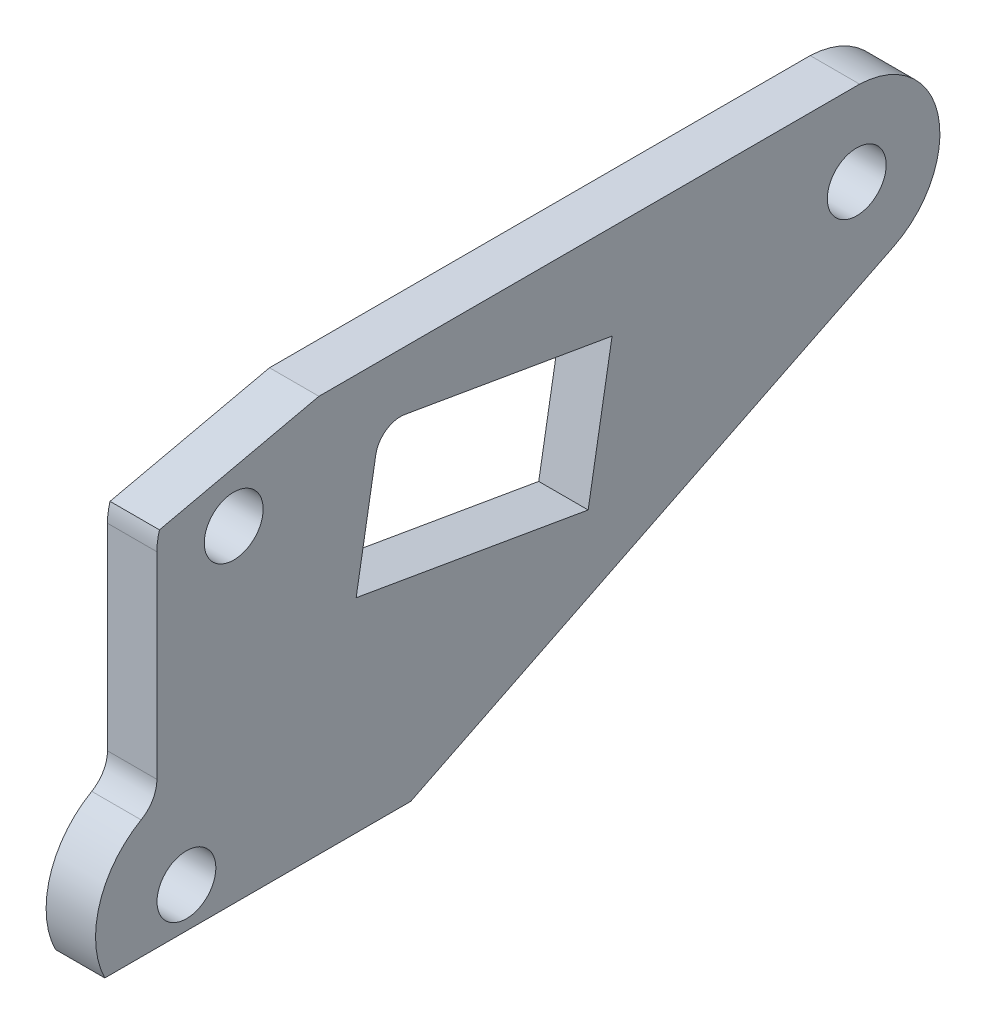
ISO-10303-21;
HEADER;
FILE_DESCRIPTION(('STEP AP214'),'2;1');
FILE_NAME('part.step','',(''),(''),'','','');
FILE_SCHEMA(('AUTOMOTIVE_DESIGN { 1 0 10303 214 1 1 1 1 }'));
ENDSEC;
DATA;
#1=APPLICATION_CONTEXT('core data for automotive mechanical design processes');
#2=APPLICATION_PROTOCOL_DEFINITION('international standard','automotive_design',2000,#1);
#3=PRODUCT_CONTEXT('',#1,'mechanical');
#4=PRODUCT('Part','Part','',(#3));
#5=PRODUCT_RELATED_PRODUCT_CATEGORY('part','',(#4));
#6=PRODUCT_DEFINITION_FORMATION('','',#4);
#7=PRODUCT_DEFINITION_CONTEXT('part definition',#1,'design');
#8=PRODUCT_DEFINITION('design','',#6,#7);
#9=PRODUCT_DEFINITION_SHAPE('','',#8);
#10=(LENGTH_UNIT() NAMED_UNIT(*) SI_UNIT(.MILLI.,.METRE.));
#11=(NAMED_UNIT(*) PLANE_ANGLE_UNIT() SI_UNIT($,.RADIAN.));
#12=(NAMED_UNIT(*) SI_UNIT($,.STERADIAN.) SOLID_ANGLE_UNIT());
#13=UNCERTAINTY_MEASURE_WITH_UNIT(LENGTH_MEASURE(1.E-05),#10,'distance_accuracy_value','');
#14=(GEOMETRIC_REPRESENTATION_CONTEXT(3) GLOBAL_UNCERTAINTY_ASSIGNED_CONTEXT((#13)) GLOBAL_UNIT_ASSIGNED_CONTEXT((#10,
#11,#12)) REPRESENTATION_CONTEXT('',''));
#15=CARTESIAN_POINT('',(0.,0.,0.));
#16=DIRECTION('',(0.,0.,1.));
#17=DIRECTION('',(1.,0.,0.));
#18=AXIS2_PLACEMENT_3D('',#15,#16,#17);
#19=CARTESIAN_POINT('',(2.,6.52334532425955,37.8465687056194));
#20=DIRECTION('',(0.,-0.169858235561271,-0.985468507772832));
#21=DIRECTION('',(0.,0.985468507772832,-0.169858235561271));
#22=AXIS2_PLACEMENT_3D('',#19,#20,#21);
#23=PLANE('',#22);
#24=DIRECTION('',(0.,-0.985468507772832,0.169858235561271));
#25=VECTOR('',#24,1.);
#26=CARTESIAN_POINT('',(-2.,6.52334532425955,37.8465687056194));
#27=LINE('',#26,#25);
#28=CARTESIAN_POINT('',(-2.,0.318688832561539,38.9160214538614));
#29=VERTEX_POINT('',#28);
#30=CARTESIAN_POINT('',(-2.,-8.89472787232873,40.504072916328));
#31=VERTEX_POINT('',#30);
#32=EDGE_CURVE('E205',#29,#31,#27,.T.);
#33=ORIENTED_EDGE('',*,*,#32,.F.);
#34=DIRECTION('',(-1.,0.,0.));
#35=VECTOR('',#34,1.);
#36=CARTESIAN_POINT('',(2.,0.318688832561539,38.9160214538614));
#37=LINE('',#36,#35);
#38=CARTESIAN_POINT('',(2.,0.318688832561539,38.9160214538614));
#39=VERTEX_POINT('',#38);
#40=EDGE_CURVE('E11',#39,#29,#37,.T.);
#41=ORIENTED_EDGE('',*,*,#40,.F.);
#42=DIRECTION('',(0.,-0.985468507772832,0.169858235561271));
#43=VECTOR('',#42,1.);
#44=CARTESIAN_POINT('',(2.,6.52334532425955,37.8465687056194));
#45=LINE('',#44,#43);
#46=CARTESIAN_POINT('',(2.,-8.89472787232873,40.504072916328));
#47=VERTEX_POINT('',#46);
#48=EDGE_CURVE('E242',#39,#47,#45,.T.);
#49=ORIENTED_EDGE('',*,*,#48,.T.);
#50=DIRECTION('',(-1.,0.,0.));
#51=VECTOR('',#50,1.);
#52=CARTESIAN_POINT('',(2.,-8.89472787232873,40.504072916328));
#53=LINE('',#52,#51);
#54=EDGE_CURVE('E56',#47,#31,#53,.T.);
#55=ORIENTED_EDGE('',*,*,#54,.T.);
#56=EDGE_LOOP('',(#33,#41,#49,#55));
#57=FACE_BOUND('',#56,.T.);
#58=ADVANCED_FACE('F37',(#57),#23,.T.);
#59=CARTESIAN_POINT('',(2.,-0.02646310209895,36.913549446067));
#60=DIRECTION('',(-1.,0.,0.));
#61=DIRECTION('',(0.,0.,1.));
#62=AXIS2_PLACEMENT_3D('',#59,#60,#61);
#63=CYLINDRICAL_SURFACE('',#62,2.032);
#64=CARTESIAN_POINT('',(-2.,-0.02646310209895,36.913549446067));
#65=DIRECTION('',(1.,0.,0.));
#66=DIRECTION('',(0.,0.,-1.));
#67=AXIS2_PLACEMENT_3D('',#64,#65,#66);
#68=CIRCLE('',#67,2.032);
#69=CARTESIAN_POINT('',(-2.,1.97600890569544,36.5683975114065));
#70=VERTEX_POINT('',#69);
#71=EDGE_CURVE('E202',#29,#70,#68,.F.);
#72=ORIENTED_EDGE('',*,*,#71,.T.);
#73=DIRECTION('',(-1.,0.,0.));
#74=VECTOR('',#73,1.);
#75=CARTESIAN_POINT('',(2.,1.97600890569544,36.5683975114065));
#76=LINE('',#75,#74);
#77=CARTESIAN_POINT('',(2.,1.97600890569544,36.5683975114065));
#78=VERTEX_POINT('',#77);
#79=EDGE_CURVE('E47',#78,#70,#76,.T.);
#80=ORIENTED_EDGE('',*,*,#79,.F.);
#81=CARTESIAN_POINT('',(2.,-0.02646310209895,36.913549446067));
#82=DIRECTION('',(1.,0.,0.));
#83=DIRECTION('',(0.,0.,-1.));
#84=AXIS2_PLACEMENT_3D('',#81,#82,#83);
#85=CIRCLE('',#84,2.032);
#86=EDGE_CURVE('E161',#39,#78,#85,.F.);
#87=ORIENTED_EDGE('',*,*,#86,.F.);
#88=ORIENTED_EDGE('',*,*,#40,.T.);
#89=EDGE_LOOP('',(#72,#80,#87,#88));
#90=FACE_BOUND('',#89,.T.);
#91=ADVANCED_FACE('F329',(#90),#63,.F.);
#92=CARTESIAN_POINT('',(2.,-4.2021844839036,0.724300813581509));
#93=DIRECTION('',(0.,0.985468507772832,-0.169858235561271));
#94=DIRECTION('',(0.,0.169858235561271,0.985468507772832));
#95=AXIS2_PLACEMENT_3D('',#92,#93,#94);
#96=PLANE('',#95);
#97=DIRECTION('',(0.,-0.169858235561271,-0.985468507772832));
#98=VECTOR('',#97,1.);
#99=CARTESIAN_POINT('',(-2.,-4.2021844839036,0.724300813581509));
#100=LINE('',#99,#98);
#101=CARTESIAN_POINT('',(-2.,-0.914638547086267,19.7976944461285));
#102=VERTEX_POINT('',#101);
#103=EDGE_CURVE('E167',#70,#102,#100,.T.);
#104=ORIENTED_EDGE('',*,*,#103,.T.);
#105=DIRECTION('',(-1.,0.,0.));
#106=VECTOR('',#105,1.);
#107=CARTESIAN_POINT('',(2.,-0.914638547086267,19.7976944461285));
#108=LINE('',#107,#106);
#109=CARTESIAN_POINT('',(2.,-0.914638547086267,19.7976944461285));
#110=VERTEX_POINT('',#109);
#111=EDGE_CURVE('E150',#110,#102,#108,.T.);
#112=ORIENTED_EDGE('',*,*,#111,.F.);
#113=DIRECTION('',(0.,-0.169858235561271,-0.985468507772832));
#114=VECTOR('',#113,1.);
#115=CARTESIAN_POINT('',(2.,-4.2021844839036,0.724300813581509));
#116=LINE('',#115,#114);
#117=EDGE_CURVE('E155',#78,#110,#116,.T.);
#118=ORIENTED_EDGE('',*,*,#117,.F.);
#119=ORIENTED_EDGE('',*,*,#79,.T.);
#120=EDGE_LOOP('',(#104,#112,#118,#119));
#121=FACE_BOUND('',#120,.T.);
#122=ADVANCED_FACE('F166',(#121),#96,.F.);
#123=CARTESIAN_POINT('',(2.,3.28754593681734,19.073393632547));
#124=DIRECTION('',(0.,-0.169858235561272,-0.985468507772832));
#125=DIRECTION('',(0.,0.985468507772832,-0.169858235561272));
#126=AXIS2_PLACEMENT_3D('',#123,#124,#125);
#127=PLANE('',#126);
#128=DIRECTION('',(0.,-0.985468507772832,0.169858235561272));
#129=VECTOR('',#128,1.);
#130=CARTESIAN_POINT('',(-2.,3.28754593681734,19.073393632547));
#131=LINE('',#130,#129);
#132=CARTESIAN_POINT('',(-2.,-12.1305272597709,21.7308978432556));
#133=VERTEX_POINT('',#132);
#134=EDGE_CURVE('E199',#102,#133,#131,.T.);
#135=ORIENTED_EDGE('',*,*,#134,.T.);
#136=DIRECTION('',(-1.,0.,0.));
#137=VECTOR('',#136,1.);
#138=CARTESIAN_POINT('',(2.,-12.1305272597709,21.7308978432556));
#139=LINE('',#138,#137);
#140=CARTESIAN_POINT('',(2.,-12.1305272597709,21.7308978432556));
#141=VERTEX_POINT('',#140);
#142=EDGE_CURVE('E100',#141,#133,#139,.T.);
#143=ORIENTED_EDGE('',*,*,#142,.F.);
#144=DIRECTION('',(0.,-0.985468507772832,0.169858235561272));
#145=VECTOR('',#144,1.);
#146=CARTESIAN_POINT('',(2.,3.28754593681734,19.073393632547));
#147=LINE('',#146,#145);
#148=EDGE_CURVE('E146',#110,#141,#147,.T.);
#149=ORIENTED_EDGE('',*,*,#148,.F.);
#150=ORIENTED_EDGE('',*,*,#111,.T.);
#151=EDGE_LOOP('',(#135,#143,#149,#150));
#152=FACE_BOUND('',#151,.T.);
#153=ADVANCED_FACE('F148',(#152),#127,.F.);
#154=CARTESIAN_POINT('',(2.,0.,56.6254002273468));
#155=DIRECTION('',(0.,0.,-1.));
#156=DIRECTION('',(-1.,0.,0.));
#157=AXIS2_PLACEMENT_3D('',#154,#155,#156);
#158=PLANE('',#157);
#159=DIRECTION('',(0.,-1.,0.));
#160=VECTOR('',#159,1.);
#161=CARTESIAN_POINT('',(-2.,0.,56.6254002273468));
#162=LINE('',#161,#160);
#163=CARTESIAN_POINT('',(-2.,2.38699131838962,56.6254002273468));
#164=VERTEX_POINT('',#163);
#165=CARTESIAN_POINT('',(-2.,-13.5592215366912,56.6254002273468));
#166=VERTEX_POINT('',#165);
#167=EDGE_CURVE('E229',#164,#166,#162,.T.);
#168=ORIENTED_EDGE('',*,*,#167,.T.);
#169=DIRECTION('',(-1.,0.,0.));
#170=VECTOR('',#169,1.);
#171=CARTESIAN_POINT('',(2.,-13.5592215366912,56.6254002273468));
#172=LINE('',#171,#170);
#173=CARTESIAN_POINT('',(2.,-13.5592215366912,56.6254002273468));
#174=VERTEX_POINT('',#173);
#175=EDGE_CURVE('E41',#174,#166,#172,.T.);
#176=ORIENTED_EDGE('',*,*,#175,.F.);
#177=DIRECTION('',(0.,-1.,0.));
#178=VECTOR('',#177,1.);
#179=CARTESIAN_POINT('',(2.,0.,56.6254002273468));
#180=LINE('',#179,#178);
#181=CARTESIAN_POINT('',(2.,2.38699131838962,56.6254002273468));
#182=VERTEX_POINT('',#181);
#183=EDGE_CURVE('E265',#182,#174,#180,.T.);
#184=ORIENTED_EDGE('',*,*,#183,.F.);
#185=DIRECTION('',(-1.,0.,0.));
#186=VECTOR('',#185,1.);
#187=CARTESIAN_POINT('',(2.,2.38699131838962,56.6254002273468));
#188=LINE('',#187,#186);
#189=EDGE_CURVE('E173',#182,#164,#188,.T.);
#190=ORIENTED_EDGE('',*,*,#189,.T.);
#191=EDGE_LOOP('',(#168,#176,#184,#190));
#192=FACE_BOUND('',#191,.T.);
#193=ADVANCED_FACE('F291',(#192),#158,.F.);
#194=CARTESIAN_POINT('',(2.,-13.5592215366912,59.1654002273468));
#195=DIRECTION('',(-1.,0.,0.));
#196=DIRECTION('',(0.,0.,1.));
#197=AXIS2_PLACEMENT_3D('',#194,#195,#196);
#198=CYLINDRICAL_SURFACE('',#197,2.54);
#199=CARTESIAN_POINT('',(-2.,-13.5592215366912,59.1654002273468));
#200=DIRECTION('',(1.,0.,0.));
#201=DIRECTION('',(0.,0.,-1.));
#202=AXIS2_PLACEMENT_3D('',#199,#200,#201);
#203=CIRCLE('',#202,2.54);
#204=CARTESIAN_POINT('',(-2.,-15.7615105365102,57.8998872241437));
#205=VERTEX_POINT('',#204);
#206=EDGE_CURVE('E227',#166,#205,#203,.F.);
#207=ORIENTED_EDGE('',*,*,#206,.T.);
#208=DIRECTION('',(-1.,0.,0.));
#209=VECTOR('',#208,1.);
#210=CARTESIAN_POINT('',(2.,-15.7615105365102,57.8998872241437));
#211=LINE('',#210,#209);
#212=CARTESIAN_POINT('',(2.,-15.7615105365102,57.8998872241437));
#213=VERTEX_POINT('',#212);
#214=EDGE_CURVE('E186',#213,#205,#211,.T.);
#215=ORIENTED_EDGE('',*,*,#214,.F.);
#216=CARTESIAN_POINT('',(2.,-13.5592215366912,59.1654002273468));
#217=DIRECTION('',(1.,0.,0.));
#218=DIRECTION('',(0.,0.,-1.));
#219=AXIS2_PLACEMENT_3D('',#216,#217,#218);
#220=CIRCLE('',#219,2.54);
#221=EDGE_CURVE('E113',#174,#213,#220,.F.);
#222=ORIENTED_EDGE('',*,*,#221,.F.);
#223=ORIENTED_EDGE('',*,*,#175,.T.);
#224=EDGE_LOOP('',(#207,#215,#222,#223));
#225=FACE_BOUND('',#224,.T.);
#226=ADVANCED_FACE('F320',(#225),#198,.F.);
#227=CARTESIAN_POINT('',(2.,-22.137211246104,54.2361845251858));
#228=DIRECTION('',(-1.,0.,0.));
#229=DIRECTION('',(0.,0.,1.));
#230=AXIS2_PLACEMENT_3D('',#227,#228,#229);
#231=CYLINDRICAL_SURFACE('',#230,7.35338541113316);
#232=CARTESIAN_POINT('',(-2.,-22.137211246104,54.2361845251858));
#233=DIRECTION('',(1.,0.,0.));
#234=DIRECTION('',(0.,0.,-1.));
#235=AXIS2_PLACEMENT_3D('',#232,#233,#234);
#236=CIRCLE('',#235,7.35338541113316);
#237=CARTESIAN_POINT('',(-2.,-25.3718603453728,60.8399199990873));
#238=VERTEX_POINT('',#237);
#239=EDGE_CURVE('E225',#205,#238,#236,.T.);
#240=ORIENTED_EDGE('',*,*,#239,.T.);
#241=DIRECTION('',(-1.,0.,0.));
#242=VECTOR('',#241,1.);
#243=CARTESIAN_POINT('',(2.,-25.3718603453728,60.8399199990873));
#244=LINE('',#243,#242);
#245=CARTESIAN_POINT('',(2.,-25.3718603453728,60.8399199990873));
#246=VERTEX_POINT('',#245);
#247=EDGE_CURVE('E185',#246,#238,#244,.T.);
#248=ORIENTED_EDGE('',*,*,#247,.F.);
#249=CARTESIAN_POINT('',(2.,-22.137211246104,54.2361845251858));
#250=DIRECTION('',(1.,0.,0.));
#251=DIRECTION('',(0.,0.,-1.));
#252=AXIS2_PLACEMENT_3D('',#249,#250,#251);
#253=CIRCLE('',#252,7.35338541113316);
#254=EDGE_CURVE('E262',#213,#246,#253,.T.);
#255=ORIENTED_EDGE('',*,*,#254,.F.);
#256=ORIENTED_EDGE('',*,*,#214,.T.);
#257=EDGE_LOOP('',(#240,#248,#255,#256));
#258=FACE_BOUND('',#257,.T.);
#259=ADVANCED_FACE('F318',(#258),#231,.T.);
#260=CARTESIAN_POINT('',(2.,-25.3718603453728,0.));
#261=DIRECTION('',(0.,-1.,0.));
#262=DIRECTION('',(0.,0.,-1.));
#263=AXIS2_PLACEMENT_3D('',#260,#261,#262);
#264=PLANE('',#263);
#265=DIRECTION('',(0.,0.,1.));
#266=VECTOR('',#265,1.);
#267=CARTESIAN_POINT('',(-2.,-25.3718603453728,0.));
#268=LINE('',#267,#266);
#269=CARTESIAN_POINT('',(-2.,-25.3718603453728,36.0875206472883));
#270=VERTEX_POINT('',#269);
#271=EDGE_CURVE('E222',#270,#238,#268,.T.);
#272=ORIENTED_EDGE('',*,*,#271,.F.);
#273=DIRECTION('',(-1.,0.,0.));
#274=VECTOR('',#273,1.);
#275=CARTESIAN_POINT('',(2.,-25.3718603453728,36.0875206472883));
#276=LINE('',#275,#274);
#277=CARTESIAN_POINT('',(2.,-25.3718603453728,36.0875206472883));
#278=VERTEX_POINT('',#277);
#279=EDGE_CURVE('E183',#278,#270,#276,.T.);
#280=ORIENTED_EDGE('',*,*,#279,.F.);
#281=DIRECTION('',(0.,0.,1.));
#282=VECTOR('',#281,1.);
#283=CARTESIAN_POINT('',(2.,-25.3718603453728,0.));
#284=LINE('',#283,#282);
#285=EDGE_CURVE('E259',#278,#246,#284,.T.);
#286=ORIENTED_EDGE('',*,*,#285,.T.);
#287=ORIENTED_EDGE('',*,*,#247,.T.);
#288=EDGE_LOOP('',(#272,#280,#286,#287));
#289=FACE_BOUND('',#288,.T.);
#290=ADVANCED_FACE('F315',(#289),#264,.T.);
#291=CARTESIAN_POINT('',(2.,-6.03157576772591,-2.98549735266419));
#292=DIRECTION('',(0.,-0.896220268256161,-0.443609322227177));
#293=DIRECTION('',(0.,0.443609322227177,-0.896220268256161));
#294=AXIS2_PLACEMENT_3D('',#291,#292,#293);
#295=PLANE('',#294);
#296=DIRECTION('',(0.,-0.443609322227177,0.896220268256161));
#297=VECTOR('',#296,1.);
#298=CARTESIAN_POINT('',(-2.,-6.03157576772591,-2.98549735266419));
#299=LINE('',#298,#297);
#300=CARTESIAN_POINT('',(-2.,-6.0315757677259,-2.98549735266419));
#301=VERTEX_POINT('',#300);
#302=EDGE_CURVE('E219',#301,#270,#299,.T.);
#303=ORIENTED_EDGE('',*,*,#302,.F.);
#304=DIRECTION('',(-1.,0.,0.));
#305=VECTOR('',#304,1.);
#306=CARTESIAN_POINT('',(2.,-6.0315757677259,-2.98549735266419));
#307=LINE('',#306,#305);
#308=CARTESIAN_POINT('',(2.,-6.0315757677259,-2.98549735266419));
#309=VERTEX_POINT('',#308);
#310=EDGE_CURVE('E181',#309,#301,#307,.T.);
#311=ORIENTED_EDGE('',*,*,#310,.F.);
#312=DIRECTION('',(0.,-0.443609322227177,0.896220268256161));
#313=VECTOR('',#312,1.);
#314=CARTESIAN_POINT('',(2.,-6.03157576772591,-2.98549735266419));
#315=LINE('',#314,#313);
#316=EDGE_CURVE('E256',#309,#278,#315,.T.);
#317=ORIENTED_EDGE('',*,*,#316,.T.);
#318=ORIENTED_EDGE('',*,*,#279,.T.);
#319=EDGE_LOOP('',(#303,#311,#317,#318));
#320=FACE_BOUND('',#319,.T.);
#321=ADVANCED_FACE('F312',(#320),#295,.T.);
#322=CARTESIAN_POINT('',(2.,0.,0.));
#323=DIRECTION('',(-1.,0.,0.));
#324=DIRECTION('',(0.,0.,1.));
#325=AXIS2_PLACEMENT_3D('',#322,#323,#324);
#326=CYLINDRICAL_SURFACE('',#325,6.73001490968506);
#327=CARTESIAN_POINT('',(-2.,0.,0.));
#328=DIRECTION('',(1.,0.,0.));
#329=DIRECTION('',(0.,0.,-1.));
#330=AXIS2_PLACEMENT_3D('',#327,#328,#329);
#331=CIRCLE('',#330,6.73001490968506);
#332=CARTESIAN_POINT('',(-2.,6.72598374953626,-0.232901879677734));
#333=VERTEX_POINT('',#332);
#334=EDGE_CURVE('E216',#333,#301,#331,.F.);
#335=ORIENTED_EDGE('',*,*,#334,.F.);
#336=DIRECTION('',(-1.,0.,0.));
#337=VECTOR('',#336,1.);
#338=CARTESIAN_POINT('',(2.,6.72598374953626,-0.232901879677734));
#339=LINE('',#338,#337);
#340=CARTESIAN_POINT('',(2.,6.72598374953626,-0.232901879677734));
#341=VERTEX_POINT('',#340);
#342=EDGE_CURVE('E179',#341,#333,#339,.T.);
#343=ORIENTED_EDGE('',*,*,#342,.F.);
#344=CARTESIAN_POINT('',(2.,0.,0.));
#345=DIRECTION('',(1.,0.,0.));
#346=DIRECTION('',(0.,0.,-1.));
#347=AXIS2_PLACEMENT_3D('',#344,#345,#346);
#348=CIRCLE('',#347,6.73001490968506);
#349=EDGE_CURVE('E253',#341,#309,#348,.F.);
#350=ORIENTED_EDGE('',*,*,#349,.T.);
#351=ORIENTED_EDGE('',*,*,#310,.T.);
#352=EDGE_LOOP('',(#335,#343,#350,#351));
#353=FACE_BOUND('',#352,.T.);
#354=ADVANCED_FACE('F308',(#353),#326,.T.);
#355=CARTESIAN_POINT('',(2.,6.72598374953626,0.));
#356=DIRECTION('',(0.,1.,0.));
#357=DIRECTION('',(0.,0.,1.));
#358=AXIS2_PLACEMENT_3D('',#355,#356,#357);
#359=PLANE('',#358);
#360=DIRECTION('',(0.,0.,-1.));
#361=VECTOR('',#360,1.);
#362=CARTESIAN_POINT('',(-2.,6.72598374953626,0.));
#363=LINE('',#362,#361);
#364=CARTESIAN_POINT('',(-2.,6.72598374953626,43.5151442643136));
#365=VERTEX_POINT('',#364);
#366=EDGE_CURVE('E213',#365,#333,#363,.T.);
#367=ORIENTED_EDGE('',*,*,#366,.F.);
#368=DIRECTION('',(-1.,0.,0.));
#369=VECTOR('',#368,1.);
#370=CARTESIAN_POINT('',(2.,6.72598374953626,43.5151442643136));
#371=LINE('',#370,#369);
#372=CARTESIAN_POINT('',(2.,6.72598374953626,43.5151442643136));
#373=VERTEX_POINT('',#372);
#374=EDGE_CURVE('E177',#373,#365,#371,.T.);
#375=ORIENTED_EDGE('',*,*,#374,.F.);
#376=DIRECTION('',(0.,0.,-1.));
#377=VECTOR('',#376,1.);
#378=CARTESIAN_POINT('',(2.,6.72598374953626,0.));
#379=LINE('',#378,#377);
#380=EDGE_CURVE('E250',#373,#341,#379,.T.);
#381=ORIENTED_EDGE('',*,*,#380,.T.);
#382=ORIENTED_EDGE('',*,*,#342,.T.);
#383=EDGE_LOOP('',(#367,#375,#381,#382));
#384=FACE_BOUND('',#383,.T.);
#385=ADVANCED_FACE('F304',(#384),#359,.T.);
#386=CARTESIAN_POINT('',(2.,15.7310699208683,3.54405229437318));
#387=DIRECTION('',(0.,0.975549137547748,0.219781437409633));
#388=DIRECTION('',(0.,-0.219781437409633,0.975549137547749));
#389=AXIS2_PLACEMENT_3D('',#386,#387,#388);
#390=PLANE('',#389);
#391=DIRECTION('',(0.,0.219781437409633,-0.975549137547749));
#392=VECTOR('',#391,1.);
#393=CARTESIAN_POINT('',(-2.,15.7310699208683,3.54405229437318));
#394=LINE('',#393,#392);
#395=CARTESIAN_POINT('',(-2.,3.81877209274241,56.4194543729419));
#396=VERTEX_POINT('',#395);
#397=EDGE_CURVE('E210',#396,#365,#394,.T.);
#398=ORIENTED_EDGE('',*,*,#397,.F.);
#399=DIRECTION('',(-1.,0.,0.));
#400=VECTOR('',#399,1.);
#401=CARTESIAN_POINT('',(2.,3.81877209274241,56.4194543729419));
#402=LINE('',#401,#400);
#403=CARTESIAN_POINT('',(2.,3.81877209274241,56.4194543729419));
#404=VERTEX_POINT('',#403);
#405=EDGE_CURVE('E175',#404,#396,#402,.T.);
#406=ORIENTED_EDGE('',*,*,#405,.F.);
#407=DIRECTION('',(0.,0.219781437409633,-0.975549137547749));
#408=VECTOR('',#407,1.);
#409=CARTESIAN_POINT('',(2.,15.7310699208683,3.54405229437318));
#410=LINE('',#409,#408);
#411=EDGE_CURVE('E247',#404,#373,#410,.T.);
#412=ORIENTED_EDGE('',*,*,#411,.T.);
#413=ORIENTED_EDGE('',*,*,#374,.T.);
#414=EDGE_LOOP('',(#398,#406,#412,#413));
#415=FACE_BOUND('',#414,.T.);
#416=ADVANCED_FACE('F300',(#415),#390,.T.);
#417=CARTESIAN_POINT('',(2.,2.38699131838962,51.5454002273468));
#418=DIRECTION('',(-1.,0.,0.));
#419=DIRECTION('',(0.,0.,1.));
#420=AXIS2_PLACEMENT_3D('',#417,#418,#419);
#421=CYLINDRICAL_SURFACE('',#420,5.08);
#422=CARTESIAN_POINT('',(-2.,2.38699131838962,51.5454002273468));
#423=DIRECTION('',(1.,0.,0.));
#424=DIRECTION('',(0.,0.,-1.));
#425=AXIS2_PLACEMENT_3D('',#422,#423,#424);
#426=CIRCLE('',#425,5.08);
#427=EDGE_CURVE('E207',#164,#396,#426,.F.);
#428=ORIENTED_EDGE('',*,*,#427,.F.);
#429=ORIENTED_EDGE('',*,*,#189,.F.);
#430=CARTESIAN_POINT('',(2.,2.38699131838962,51.5454002273468));
#431=DIRECTION('',(1.,0.,0.));
#432=DIRECTION('',(0.,0.,-1.));
#433=AXIS2_PLACEMENT_3D('',#430,#431,#432);
#434=CIRCLE('',#433,5.08);
#435=EDGE_CURVE('E244',#182,#404,#434,.F.);
#436=ORIENTED_EDGE('',*,*,#435,.T.);
#437=ORIENTED_EDGE('',*,*,#405,.T.);
#438=EDGE_LOOP('',(#428,#429,#436,#437));
#439=FACE_BOUND('',#438,.T.);
#440=ADVANCED_FACE('F297',(#439),#421,.T.);
#441=CARTESIAN_POINT('',(2.,1.07937569190719,50.4101289105847));
#442=DIRECTION('',(-1.,0.,0.));
#443=DIRECTION('',(0.,0.,1.));
#444=AXIS2_PLACEMENT_3D('',#441,#442,#443);
#445=CYLINDRICAL_SURFACE('',#444,2.38125);
#446=CARTESIAN_POINT('',(2.,1.07937569190719,50.4101289105847));
#447=DIRECTION('',(1.,0.,0.));
#448=DIRECTION('',(0.,0.,-1.));
#449=AXIS2_PLACEMENT_3D('',#446,#447,#448);
#450=CIRCLE('',#449,2.38125);
#451=CARTESIAN_POINT('',(2.,1.07937569190719,48.0288789105847));
#452=VERTEX_POINT('',#451);
#453=EDGE_CURVE('E267',#452,#452,#450,.T.);
#454=ORIENTED_EDGE('',*,*,#453,.T.);
#455=EDGE_LOOP('',(#454));
#456=FACE_BOUND('',#455,.T.);
#457=CARTESIAN_POINT('',(-2.,1.07937569190719,50.4101289105847));
#458=DIRECTION('',(1.,0.,0.));
#459=DIRECTION('',(0.,0.,-1.));
#460=AXIS2_PLACEMENT_3D('',#457,#458,#459);
#461=CIRCLE('',#460,2.38125);
#462=CARTESIAN_POINT('',(-2.,1.07937569190719,48.0288789105847));
#463=VERTEX_POINT('',#462);
#464=EDGE_CURVE('E231',#463,#463,#461,.T.);
#465=ORIENTED_EDGE('',*,*,#464,.F.);
#466=EDGE_LOOP('',(#465));
#467=FACE_BOUND('',#466,.T.);
#468=ADVANCED_FACE('F340',(#456,#467),#445,.F.);
#469=CARTESIAN_POINT('',(2.,-22.137211246104,54.2361845251858));
#470=DIRECTION('',(-1.,0.,0.));
#471=DIRECTION('',(0.,0.,1.));
#472=AXIS2_PLACEMENT_3D('',#469,#470,#471);
#473=CYLINDRICAL_SURFACE('',#472,2.38125);
#474=CARTESIAN_POINT('',(2.,-22.137211246104,54.2361845251858));
#475=DIRECTION('',(1.,0.,0.));
#476=DIRECTION('',(0.,0.,-1.));
#477=AXIS2_PLACEMENT_3D('',#474,#475,#476);
#478=CIRCLE('',#477,2.38125);
#479=CARTESIAN_POINT('',(2.,-22.137211246104,51.8549345251858));
#480=VERTEX_POINT('',#479);
#481=EDGE_CURVE('E270',#480,#480,#478,.T.);
#482=ORIENTED_EDGE('',*,*,#481,.T.);
#483=EDGE_LOOP('',(#482));
#484=FACE_BOUND('',#483,.T.);
#485=CARTESIAN_POINT('',(-2.,-22.137211246104,54.2361845251858));
#486=DIRECTION('',(1.,0.,0.));
#487=DIRECTION('',(0.,0.,-1.));
#488=AXIS2_PLACEMENT_3D('',#485,#486,#487);
#489=CIRCLE('',#488,2.38125);
#490=CARTESIAN_POINT('',(-2.,-22.137211246104,51.8549345251858));
#491=VERTEX_POINT('',#490);
#492=EDGE_CURVE('E234',#491,#491,#489,.T.);
#493=ORIENTED_EDGE('',*,*,#492,.F.);
#494=EDGE_LOOP('',(#493));
#495=FACE_BOUND('',#494,.T.);
#496=ADVANCED_FACE('F374',(#484,#495),#473,.F.);
#497=CARTESIAN_POINT('',(2.,0.,0.));
#498=DIRECTION('',(-1.,0.,0.));
#499=DIRECTION('',(0.,0.,1.));
#500=AXIS2_PLACEMENT_3D('',#497,#498,#499);
#501=CYLINDRICAL_SURFACE('',#500,2.38125);
#502=CARTESIAN_POINT('',(2.,0.,0.));
#503=DIRECTION('',(1.,0.,0.));
#504=DIRECTION('',(0.,0.,-1.));
#505=AXIS2_PLACEMENT_3D('',#502,#503,#504);
#506=CIRCLE('',#505,2.38125);
#507=CARTESIAN_POINT('',(2.,0.,-2.38125));
#508=VERTEX_POINT('',#507);
#509=EDGE_CURVE('E198',#508,#508,#506,.T.);
#510=ORIENTED_EDGE('',*,*,#509,.T.);
#511=EDGE_LOOP('',(#510));
#512=FACE_BOUND('',#511,.T.);
#513=CARTESIAN_POINT('',(-2.,0.,0.));
#514=DIRECTION('',(1.,0.,0.));
#515=DIRECTION('',(0.,0.,-1.));
#516=AXIS2_PLACEMENT_3D('',#513,#514,#515);
#517=CIRCLE('',#516,2.38125);
#518=CARTESIAN_POINT('',(-2.,0.,-2.38125));
#519=VERTEX_POINT('',#518);
#520=EDGE_CURVE('E237',#519,#519,#517,.T.);
#521=ORIENTED_EDGE('',*,*,#520,.F.);
#522=EDGE_LOOP('',(#521));
#523=FACE_BOUND('',#522,.T.);
#524=ADVANCED_FACE('F39',(#512,#523),#501,.F.);
#525=CARTESIAN_POINT('',(2.,-15.4180731965883,2.65750421070858));
#526=DIRECTION('',(0.,0.985468507772832,-0.169858235561271));
#527=DIRECTION('',(0.,0.169858235561271,0.985468507772832));
#528=AXIS2_PLACEMENT_3D('',#525,#526,#527);
#529=PLANE('',#528);
#530=DIRECTION('',(0.,-0.169858235561271,-0.985468507772832));
#531=VECTOR('',#530,1.);
#532=CARTESIAN_POINT('',(-2.,-15.4180731965883,2.65750421070858));
#533=LINE('',#532,#531);
#534=EDGE_CURVE('E195',#31,#133,#533,.T.);
#535=ORIENTED_EDGE('',*,*,#534,.F.);
#536=ORIENTED_EDGE('',*,*,#54,.F.);
#537=DIRECTION('',(0.,-0.169858235561271,-0.985468507772832));
#538=VECTOR('',#537,1.);
#539=CARTESIAN_POINT('',(2.,-15.4180731965883,2.65750421070858));
#540=LINE('',#539,#538);
#541=EDGE_CURVE('E154',#47,#141,#540,.T.);
#542=ORIENTED_EDGE('',*,*,#541,.T.);
#543=ORIENTED_EDGE('',*,*,#142,.T.);
#544=EDGE_LOOP('',(#535,#536,#542,#543));
#545=FACE_BOUND('',#544,.T.);
#546=ADVANCED_FACE('F281',(#545),#529,.T.);
#547=CARTESIAN_POINT('',(2.,0.,0.));
#548=DIRECTION('',(1.,0.,0.));
#549=DIRECTION('',(0.,0.,-1.));
#550=AXIS2_PLACEMENT_3D('',#547,#548,#549);
#551=PLANE('',#550);
#552=ORIENTED_EDGE('',*,*,#509,.F.);
#553=EDGE_LOOP('',(#552));
#554=FACE_BOUND('',#553,.T.);
#555=ORIENTED_EDGE('',*,*,#481,.F.);
#556=EDGE_LOOP('',(#555));
#557=FACE_BOUND('',#556,.T.);
#558=ORIENTED_EDGE('',*,*,#453,.F.);
#559=EDGE_LOOP('',(#558));
#560=FACE_BOUND('',#559,.T.);
#561=ORIENTED_EDGE('',*,*,#183,.T.);
#562=ORIENTED_EDGE('',*,*,#221,.T.);
#563=ORIENTED_EDGE('',*,*,#254,.T.);
#564=ORIENTED_EDGE('',*,*,#285,.F.);
#565=ORIENTED_EDGE('',*,*,#316,.F.);
#566=ORIENTED_EDGE('',*,*,#349,.F.);
#567=ORIENTED_EDGE('',*,*,#380,.F.);
#568=ORIENTED_EDGE('',*,*,#411,.F.);
#569=ORIENTED_EDGE('',*,*,#435,.F.);
#570=EDGE_LOOP('',(#561,#562,#563,#564,#565,#566,#567,#568,#569));
#571=FACE_BOUND('',#570,.T.);
#572=ORIENTED_EDGE('',*,*,#48,.F.);
#573=ORIENTED_EDGE('',*,*,#86,.T.);
#574=ORIENTED_EDGE('',*,*,#117,.T.);
#575=ORIENTED_EDGE('',*,*,#148,.T.);
#576=ORIENTED_EDGE('',*,*,#541,.F.);
#577=EDGE_LOOP('',(#572,#573,#574,#575,#576));
#578=FACE_BOUND('',#577,.T.);
#579=ADVANCED_FACE('F159',(#554,#557,#560,#571,#578),#551,.T.);
#580=CARTESIAN_POINT('',(-2.,0.,0.));
#581=DIRECTION('',(1.,0.,0.));
#582=DIRECTION('',(0.,0.,-1.));
#583=AXIS2_PLACEMENT_3D('',#580,#581,#582);
#584=PLANE('',#583);
#585=ORIENTED_EDGE('',*,*,#520,.T.);
#586=EDGE_LOOP('',(#585));
#587=FACE_BOUND('',#586,.T.);
#588=ORIENTED_EDGE('',*,*,#492,.T.);
#589=EDGE_LOOP('',(#588));
#590=FACE_BOUND('',#589,.T.);
#591=ORIENTED_EDGE('',*,*,#464,.T.);
#592=EDGE_LOOP('',(#591));
#593=FACE_BOUND('',#592,.T.);
#594=ORIENTED_EDGE('',*,*,#167,.F.);
#595=ORIENTED_EDGE('',*,*,#427,.T.);
#596=ORIENTED_EDGE('',*,*,#397,.T.);
#597=ORIENTED_EDGE('',*,*,#366,.T.);
#598=ORIENTED_EDGE('',*,*,#334,.T.);
#599=ORIENTED_EDGE('',*,*,#302,.T.);
#600=ORIENTED_EDGE('',*,*,#271,.T.);
#601=ORIENTED_EDGE('',*,*,#239,.F.);
#602=ORIENTED_EDGE('',*,*,#206,.F.);
#603=EDGE_LOOP('',(#594,#595,#596,#597,#598,#599,#600,#601,#602));
#604=FACE_BOUND('',#603,.T.);
#605=ORIENTED_EDGE('',*,*,#32,.T.);
#606=ORIENTED_EDGE('',*,*,#534,.T.);
#607=ORIENTED_EDGE('',*,*,#134,.F.);
#608=ORIENTED_EDGE('',*,*,#103,.F.);
#609=ORIENTED_EDGE('',*,*,#71,.F.);
#610=EDGE_LOOP('',(#605,#606,#607,#608,#609));
#611=FACE_BOUND('',#610,.T.);
#612=ADVANCED_FACE('F280',(#587,#590,#593,#604,#611),#584,.F.);
#613=CLOSED_SHELL('',(#58,#91,#122,#153,#193,#226,#259,#290,#321,#354,#385,#416,#440,#468,#496,
#524,#546,#579,#612));
#614=MANIFOLD_SOLID_BREP('B2',#613);
#615=ADVANCED_BREP_SHAPE_REPRESENTATION('',(#18,#614),#14);
#616=SHAPE_DEFINITION_REPRESENTATION(#9,#615);
ENDSEC;
END-ISO-10303-21;
